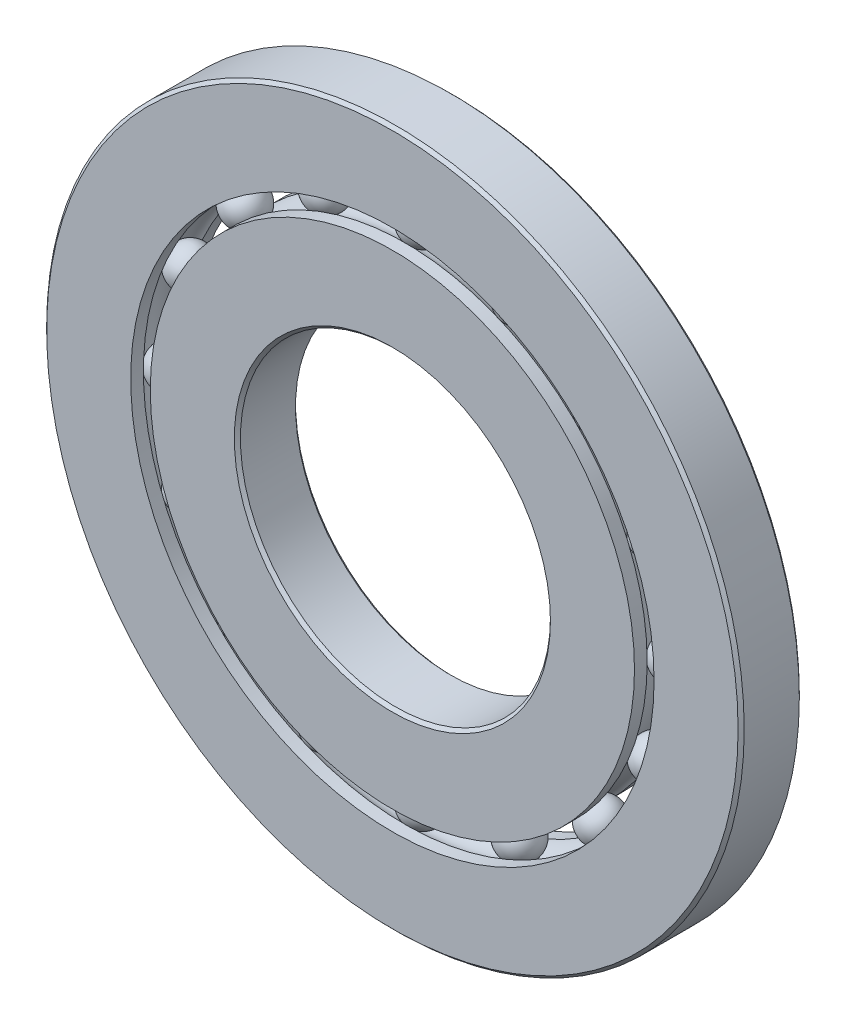
ISO-10303-21;
HEADER;
FILE_DESCRIPTION(('STEP AP214'),'2;1');
FILE_NAME('part.step','',(''),(''),'','','');
FILE_SCHEMA(('AUTOMOTIVE_DESIGN { 1 0 10303 214 1 1 1 1 }'));
ENDSEC;
DATA;
#1=APPLICATION_CONTEXT('core data for automotive mechanical design processes');
#2=APPLICATION_PROTOCOL_DEFINITION('international standard','automotive_design',2000,#1);
#3=PRODUCT_CONTEXT('',#1,'mechanical');
#4=PRODUCT('Part','Part','',(#3));
#5=PRODUCT_RELATED_PRODUCT_CATEGORY('part','',(#4));
#6=PRODUCT_DEFINITION_FORMATION('','',#4);
#7=PRODUCT_DEFINITION_CONTEXT('part definition',#1,'design');
#8=PRODUCT_DEFINITION('design','',#6,#7);
#9=PRODUCT_DEFINITION_SHAPE('','',#8);
#10=(LENGTH_UNIT() NAMED_UNIT(*) SI_UNIT(.MILLI.,.METRE.));
#11=(NAMED_UNIT(*) PLANE_ANGLE_UNIT() SI_UNIT($,.RADIAN.));
#12=(NAMED_UNIT(*) SI_UNIT($,.STERADIAN.) SOLID_ANGLE_UNIT());
#13=UNCERTAINTY_MEASURE_WITH_UNIT(LENGTH_MEASURE(1.E-05),#10,'distance_accuracy_value','');
#14=(GEOMETRIC_REPRESENTATION_CONTEXT(3) GLOBAL_UNCERTAINTY_ASSIGNED_CONTEXT((#13)) GLOBAL_UNIT_ASSIGNED_CONTEXT((#10,
#11,#12)) REPRESENTATION_CONTEXT('',''));
#15=CARTESIAN_POINT('',(0.,0.,0.));
#16=DIRECTION('',(0.,0.,1.));
#17=DIRECTION('',(1.,0.,0.));
#18=AXIS2_PLACEMENT_3D('',#15,#16,#17);
#19=CARTESIAN_POINT('',(-1.2437211551865,3.0026084806617,0.));
#20=DIRECTION('',(0.,0.,1.));
#21=DIRECTION('',(-0.382683432365077,0.923879532511292,0.));
#22=AXIS2_PLACEMENT_3D('',#19,#20,#21);
#23=SPHERICAL_SURFACE('',#22,0.263333333333333);
#24=CARTESIAN_POINT('',(-1.2437211551865,3.0026084806617,0.263333333333334));
#25=VERTEX_POINT('',#24);
#26=VERTEX_LOOP('',#25);
#27=FACE_BOUND('',#26,.T.);
#28=ADVANCED_FACE('F39',(#27),#23,.T.);
#29=CLOSED_SHELL('',(#28));
#30=MANIFOLD_SOLID_BREP('B2',#29);
#31=CARTESIAN_POINT('',(-2.29809703885625,2.29809703885631,0.));
#32=DIRECTION('',(0.,0.,1.));
#33=DIRECTION('',(-0.707106781186539,0.707106781186556,0.));
#34=AXIS2_PLACEMENT_3D('',#31,#32,#33);
#35=SPHERICAL_SURFACE('',#34,0.263333333333333);
#36=CARTESIAN_POINT('',(-2.29809703885625,2.29809703885631,0.263333333333334));
#37=VERTEX_POINT('',#36);
#38=VERTEX_LOOP('',#37);
#39=FACE_BOUND('',#38,.T.);
#40=ADVANCED_FACE('F59',(#39),#35,.T.);
#41=CLOSED_SHELL('',(#40));
#42=MANIFOLD_SOLID_BREP('B6',#41);
#43=CARTESIAN_POINT('',(-3.00260848066167,1.24372115518657,0.));
#44=DIRECTION('',(0.,0.,1.));
#45=DIRECTION('',(-0.923879532511283,0.3826834323651,0.));
#46=AXIS2_PLACEMENT_3D('',#43,#44,#45);
#47=SPHERICAL_SURFACE('',#46,0.263333333333333);
#48=CARTESIAN_POINT('',(-3.00260848066167,1.24372115518657,0.263333333333334));
#49=VERTEX_POINT('',#48);
#50=VERTEX_LOOP('',#49);
#51=FACE_BOUND('',#50,.T.);
#52=ADVANCED_FACE('F79',(#51),#47,.T.);
#53=CLOSED_SHELL('',(#52));
#54=MANIFOLD_SOLID_BREP('B35',#53);
#55=CARTESIAN_POINT('',(-3.25,0.,0.));
#56=DIRECTION('',(0.,0.,1.));
#57=DIRECTION('',(-1.,0.,0.));
#58=AXIS2_PLACEMENT_3D('',#55,#56,#57);
#59=SPHERICAL_SURFACE('',#58,0.263333333333333);
#60=CARTESIAN_POINT('',(-3.25,0.,0.263333333333334));
#61=VERTEX_POINT('',#60);
#62=VERTEX_LOOP('',#61);
#63=FACE_BOUND('',#62,.T.);
#64=ADVANCED_FACE('F99',(#63),#59,.T.);
#65=CLOSED_SHELL('',(#64));
#66=MANIFOLD_SOLID_BREP('B55',#65);
#67=CARTESIAN_POINT('',(-3.00260848066169,-1.24372115518651,0.));
#68=DIRECTION('',(0.,0.,1.));
#69=DIRECTION('',(-0.923879532511291,-0.382683432365081,0.));
#70=AXIS2_PLACEMENT_3D('',#67,#68,#69);
#71=SPHERICAL_SURFACE('',#70,0.263333333333333);
#72=CARTESIAN_POINT('',(-3.00260848066169,-1.24372115518651,0.263333333333334));
#73=VERTEX_POINT('',#72);
#74=VERTEX_LOOP('',#73);
#75=FACE_BOUND('',#74,.T.);
#76=ADVANCED_FACE('F119',(#75),#71,.T.);
#77=CLOSED_SHELL('',(#76));
#78=MANIFOLD_SOLID_BREP('B75',#77);
#79=CARTESIAN_POINT('',(-2.2980970388563,-2.29809703885626,0.));
#80=DIRECTION('',(0.,0.,1.));
#81=DIRECTION('',(-0.707106781186554,-0.707106781186541,0.));
#82=AXIS2_PLACEMENT_3D('',#79,#80,#81);
#83=SPHERICAL_SURFACE('',#82,0.263333333333333);
#84=CARTESIAN_POINT('',(-2.2980970388563,-2.29809703885626,0.263333333333334));
#85=VERTEX_POINT('',#84);
#86=VERTEX_LOOP('',#85);
#87=FACE_BOUND('',#86,.T.);
#88=ADVANCED_FACE('F139',(#87),#83,.T.);
#89=CLOSED_SHELL('',(#88));
#90=MANIFOLD_SOLID_BREP('B95',#89);
#91=CARTESIAN_POINT('',(-1.24372115518657,-3.00260848066167,0.));
#92=DIRECTION('',(0.,0.,1.));
#93=DIRECTION('',(-0.382683432365097,-0.923879532511284,0.));
#94=AXIS2_PLACEMENT_3D('',#91,#92,#93);
#95=SPHERICAL_SURFACE('',#94,0.263333333333333);
#96=CARTESIAN_POINT('',(-1.24372115518657,-3.00260848066167,0.263333333333334));
#97=VERTEX_POINT('',#96);
#98=VERTEX_LOOP('',#97);
#99=FACE_BOUND('',#98,.T.);
#100=ADVANCED_FACE('F159',(#99),#95,.T.);
#101=CLOSED_SHELL('',(#100));
#102=MANIFOLD_SOLID_BREP('B115',#101);
#103=CARTESIAN_POINT('',(0.,-3.25,0.));
#104=DIRECTION('',(0.,0.,1.));
#105=DIRECTION('',(0.,-1.,0.));
#106=AXIS2_PLACEMENT_3D('',#103,#104,#105);
#107=SPHERICAL_SURFACE('',#106,0.263333333333333);
#108=CARTESIAN_POINT('',(0.,-3.25,0.263333333333334));
#109=VERTEX_POINT('',#108);
#110=VERTEX_LOOP('',#109);
#111=FACE_BOUND('',#110,.T.);
#112=ADVANCED_FACE('F179',(#111),#107,.T.);
#113=CLOSED_SHELL('',(#112));
#114=MANIFOLD_SOLID_BREP('B135',#113);
#115=CARTESIAN_POINT('',(1.24372115518652,-3.00260848066169,0.));
#116=DIRECTION('',(0.,0.,1.));
#117=DIRECTION('',(0.382683432365084,-0.923879532511289,0.));
#118=AXIS2_PLACEMENT_3D('',#115,#116,#117);
#119=SPHERICAL_SURFACE('',#118,0.263333333333333);
#120=CARTESIAN_POINT('',(1.24372115518652,-3.00260848066169,0.263333333333334));
#121=VERTEX_POINT('',#120);
#122=VERTEX_LOOP('',#121);
#123=FACE_BOUND('',#122,.T.);
#124=ADVANCED_FACE('F199',(#123),#119,.T.);
#125=CLOSED_SHELL('',(#124));
#126=MANIFOLD_SOLID_BREP('B155',#125);
#127=CARTESIAN_POINT('',(2.29809703885627,-2.29809703885629,0.));
#128=DIRECTION('',(0.,0.,1.));
#129=DIRECTION('',(0.707106781186544,-0.707106781186551,0.));
#130=AXIS2_PLACEMENT_3D('',#127,#128,#129);
#131=SPHERICAL_SURFACE('',#130,0.263333333333333);
#132=CARTESIAN_POINT('',(2.29809703885627,-2.29809703885629,0.263333333333334));
#133=VERTEX_POINT('',#132);
#134=VERTEX_LOOP('',#133);
#135=FACE_BOUND('',#134,.T.);
#136=ADVANCED_FACE('F219',(#135),#131,.T.);
#137=CLOSED_SHELL('',(#136));
#138=MANIFOLD_SOLID_BREP('B175',#137);
#139=CARTESIAN_POINT('',(3.00260848066168,-1.24372115518655,0.));
#140=DIRECTION('',(0.,0.,1.));
#141=DIRECTION('',(0.923879532511285,-0.382683432365094,0.));
#142=AXIS2_PLACEMENT_3D('',#139,#140,#141);
#143=SPHERICAL_SURFACE('',#142,0.263333333333333);
#144=CARTESIAN_POINT('',(3.00260848066168,-1.24372115518655,0.263333333333334));
#145=VERTEX_POINT('',#144);
#146=VERTEX_LOOP('',#145);
#147=FACE_BOUND('',#146,.T.);
#148=ADVANCED_FACE('F239',(#147),#143,.T.);
#149=CLOSED_SHELL('',(#148));
#150=MANIFOLD_SOLID_BREP('B195',#149);
#151=CARTESIAN_POINT('',(3.25,0.,0.));
#152=DIRECTION('',(0.,0.,1.));
#153=DIRECTION('',(1.,0.,0.));
#154=AXIS2_PLACEMENT_3D('',#151,#152,#153);
#155=SPHERICAL_SURFACE('',#154,0.263333333333333);
#156=CARTESIAN_POINT('',(3.25,0.,0.263333333333334));
#157=VERTEX_POINT('',#156);
#158=VERTEX_LOOP('',#157);
#159=FACE_BOUND('',#158,.T.);
#160=ADVANCED_FACE('F259',(#159),#155,.T.);
#161=CLOSED_SHELL('',(#160));
#162=MANIFOLD_SOLID_BREP('B215',#161);
#163=CARTESIAN_POINT('',(3.00260848066168,1.24372115518653,0.));
#164=DIRECTION('',(0.,0.,1.));
#165=DIRECTION('',(0.923879532511288,0.382683432365087,0.));
#166=AXIS2_PLACEMENT_3D('',#163,#164,#165);
#167=SPHERICAL_SURFACE('',#166,0.263333333333333);
#168=CARTESIAN_POINT('',(3.00260848066168,1.24372115518653,0.263333333333334));
#169=VERTEX_POINT('',#168);
#170=VERTEX_LOOP('',#169);
#171=FACE_BOUND('',#170,.T.);
#172=ADVANCED_FACE('F279',(#171),#167,.T.);
#173=CLOSED_SHELL('',(#172));
#174=MANIFOLD_SOLID_BREP('B235',#173);
#175=CARTESIAN_POINT('',(2.29809703885628,2.29809703885628,0.));
#176=DIRECTION('',(0.,0.,1.));
#177=DIRECTION('',(0.707106781186549,0.707106781186546,0.));
#178=AXIS2_PLACEMENT_3D('',#175,#176,#177);
#179=SPHERICAL_SURFACE('',#178,0.263333333333333);
#180=CARTESIAN_POINT('',(2.29809703885628,2.29809703885628,0.263333333333334));
#181=VERTEX_POINT('',#180);
#182=VERTEX_LOOP('',#181);
#183=FACE_BOUND('',#182,.T.);
#184=ADVANCED_FACE('F299',(#183),#179,.T.);
#185=CLOSED_SHELL('',(#184));
#186=MANIFOLD_SOLID_BREP('B255',#185);
#187=CARTESIAN_POINT('',(1.24372115518654,3.00260848066168,0.));
#188=DIRECTION('',(0.,0.,1.));
#189=DIRECTION('',(0.382683432365091,0.923879532511287,0.));
#190=AXIS2_PLACEMENT_3D('',#187,#188,#189);
#191=SPHERICAL_SURFACE('',#190,0.263333333333333);
#192=CARTESIAN_POINT('',(1.24372115518654,3.00260848066168,0.263333333333334));
#193=VERTEX_POINT('',#192);
#194=VERTEX_LOOP('',#193);
#195=FACE_BOUND('',#194,.T.);
#196=ADVANCED_FACE('F319',(#195),#191,.T.);
#197=CLOSED_SHELL('',(#196));
#198=MANIFOLD_SOLID_BREP('B275',#197);
#199=CARTESIAN_POINT('',(0.,3.25,0.));
#200=DIRECTION('',(0.,0.,1.));
#201=DIRECTION('',(0.,1.,0.));
#202=AXIS2_PLACEMENT_3D('',#199,#200,#201);
#203=SPHERICAL_SURFACE('',#202,0.263333333333333);
#204=CARTESIAN_POINT('',(0.,3.25,0.263333333333334));
#205=VERTEX_POINT('',#204);
#206=VERTEX_LOOP('',#205);
#207=FACE_BOUND('',#206,.T.);
#208=ADVANCED_FACE('F341',(#207),#203,.T.);
#209=CLOSED_SHELL('',(#208));
#210=MANIFOLD_SOLID_BREP('B295',#209);
#211=CARTESIAN_POINT('',(0.,3.12369230769231,0.395));
#212=DIRECTION('',(0.,0.,-1.));
#213=DIRECTION('',(-1.,0.,0.));
#214=AXIS2_PLACEMENT_3D('',#211,#212,#213);
#215=PLANE('',#214);
#216=CARTESIAN_POINT('',(0.,0.,0.395));
#217=DIRECTION('',(0.,0.,1.));
#218=DIRECTION('',(1.,0.,0.));
#219=AXIS2_PLACEMENT_3D('',#216,#217,#218);
#220=CIRCLE('',#219,2.0395);
#221=CARTESIAN_POINT('',(2.0395,0.,0.395));
#222=VERTEX_POINT('',#221);
#223=EDGE_CURVE('E388',#222,#222,#220,.T.);
#224=ORIENTED_EDGE('',*,*,#223,.F.);
#225=EDGE_LOOP('',(#224));
#226=FACE_BOUND('',#225,.T.);
#227=CARTESIAN_POINT('',(0.,0.,0.395));
#228=DIRECTION('',(0.,0.,1.));
#229=DIRECTION('',(1.,0.,0.));
#230=AXIS2_PLACEMENT_3D('',#227,#228,#229);
#231=CIRCLE('',#230,3.12369230769231);
#232=CARTESIAN_POINT('',(3.12369230769231,0.,0.395));
#233=VERTEX_POINT('',#232);
#234=EDGE_CURVE('E340',#233,#233,#231,.T.);
#235=ORIENTED_EDGE('',*,*,#234,.T.);
#236=EDGE_LOOP('',(#235));
#237=FACE_BOUND('',#236,.T.);
#238=ADVANCED_FACE('F360',(#226,#237),#215,.F.);
#239=CARTESIAN_POINT('',(0.,0.,0.395));
#240=DIRECTION('',(0.,0.,1.));
#241=DIRECTION('',(1.,0.,0.));
#242=AXIS2_PLACEMENT_3D('',#239,#240,#241);
#243=CYLINDRICAL_SURFACE('',#242,3.12369230769231);
#244=ORIENTED_EDGE('',*,*,#234,.F.);
#245=EDGE_LOOP('',(#244));
#246=FACE_BOUND('',#245,.T.);
#247=CARTESIAN_POINT('',(0.,0.,0.231064517631657));
#248=DIRECTION('',(0.,0.,1.));
#249=DIRECTION('',(1.,0.,0.));
#250=AXIS2_PLACEMENT_3D('',#247,#248,#249);
#251=CIRCLE('',#250,3.12369230769231);
#252=CARTESIAN_POINT('',(3.12369230769231,0.,0.231064517631657));
#253=VERTEX_POINT('',#252);
#254=EDGE_CURVE('E366',#253,#253,#251,.T.);
#255=ORIENTED_EDGE('',*,*,#254,.T.);
#256=EDGE_LOOP('',(#255));
#257=FACE_BOUND('',#256,.T.);
#258=ADVANCED_FACE('F395',(#246,#257),#243,.T.);
#259=CARTESIAN_POINT('',(0.,0.,0.));
#260=DIRECTION('',(0.,0.,1.));
#261=DIRECTION('',(1.,0.,0.));
#262=AXIS2_PLACEMENT_3D('',#259,#260,#261);
#263=TOROIDAL_SURFACE('',#262,3.25,0.263333333333334);
#264=ORIENTED_EDGE('',*,*,#254,.F.);
#265=EDGE_LOOP('',(#264));
#266=FACE_BOUND('',#265,.T.);
#267=CARTESIAN_POINT('',(0.,0.,-0.231064517631657));
#268=DIRECTION('',(0.,0.,1.));
#269=DIRECTION('',(1.,0.,0.));
#270=AXIS2_PLACEMENT_3D('',#267,#268,#269);
#271=CIRCLE('',#270,3.12369230769231);
#272=CARTESIAN_POINT('',(3.12369230769231,0.,-0.231064517631657));
#273=VERTEX_POINT('',#272);
#274=EDGE_CURVE('E370',#273,#273,#271,.T.);
#275=ORIENTED_EDGE('',*,*,#274,.T.);
#276=EDGE_LOOP('',(#275));
#277=FACE_BOUND('',#276,.T.);
#278=ADVANCED_FACE('F399',(#266,#277),#263,.F.);
#279=CARTESIAN_POINT('',(0.,0.,0.395));
#280=DIRECTION('',(0.,0.,1.));
#281=DIRECTION('',(1.,0.,0.));
#282=AXIS2_PLACEMENT_3D('',#279,#280,#281);
#283=CYLINDRICAL_SURFACE('',#282,3.12369230769231);
#284=ORIENTED_EDGE('',*,*,#274,.F.);
#285=EDGE_LOOP('',(#284));
#286=FACE_BOUND('',#285,.T.);
#287=CARTESIAN_POINT('',(0.,0.,-0.395));
#288=DIRECTION('',(0.,0.,1.));
#289=DIRECTION('',(1.,0.,0.));
#290=AXIS2_PLACEMENT_3D('',#287,#288,#289);
#291=CIRCLE('',#290,3.12369230769231);
#292=CARTESIAN_POINT('',(3.12369230769231,0.,-0.395));
#293=VERTEX_POINT('',#292);
#294=EDGE_CURVE('E374',#293,#293,#291,.T.);
#295=ORIENTED_EDGE('',*,*,#294,.T.);
#296=EDGE_LOOP('',(#295));
#297=FACE_BOUND('',#296,.T.);
#298=ADVANCED_FACE('F404',(#286,#297),#283,.T.);
#299=CARTESIAN_POINT('',(0.,2.0395,-0.395));
#300=DIRECTION('',(0.,0.,1.));
#301=DIRECTION('',(1.,0.,0.));
#302=AXIS2_PLACEMENT_3D('',#299,#300,#301);
#303=PLANE('',#302);
#304=ORIENTED_EDGE('',*,*,#294,.F.);
#305=EDGE_LOOP('',(#304));
#306=FACE_BOUND('',#305,.T.);
#307=CARTESIAN_POINT('',(0.,0.,-0.395));
#308=DIRECTION('',(0.,0.,1.));
#309=DIRECTION('',(1.,0.,0.));
#310=AXIS2_PLACEMENT_3D('',#307,#308,#309);
#311=CIRCLE('',#310,2.0395);
#312=CARTESIAN_POINT('',(2.0395,0.,-0.395));
#313=VERTEX_POINT('',#312);
#314=EDGE_CURVE('E379',#313,#313,#311,.T.);
#315=ORIENTED_EDGE('',*,*,#314,.T.);
#316=EDGE_LOOP('',(#315));
#317=FACE_BOUND('',#316,.T.);
#318=ADVANCED_FACE('F410',(#306,#317),#303,.F.);
#319=CARTESIAN_POINT('',(0.,0.,-0.355499999999999));
#320=DIRECTION('',(0.,0.,-1.));
#321=DIRECTION('',(-1.,0.,0.));
#322=AXIS2_PLACEMENT_3D('',#319,#320,#321);
#323=CONICAL_SURFACE('',#322,2.,0.785398163397421);
#324=ORIENTED_EDGE('',*,*,#314,.F.);
#325=EDGE_LOOP('',(#324));
#326=FACE_BOUND('',#325,.T.);
#327=CARTESIAN_POINT('',(0.,0.,-0.355499999999999));
#328=DIRECTION('',(0.,0.,1.));
#329=DIRECTION('',(1.,0.,0.));
#330=AXIS2_PLACEMENT_3D('',#327,#328,#329);
#331=CIRCLE('',#330,2.);
#332=CARTESIAN_POINT('',(2.,0.,-0.355499999999999));
#333=VERTEX_POINT('',#332);
#334=EDGE_CURVE('E382',#333,#333,#331,.T.);
#335=ORIENTED_EDGE('',*,*,#334,.T.);
#336=EDGE_LOOP('',(#335));
#337=FACE_BOUND('',#336,.T.);
#338=ADVANCED_FACE('F414',(#326,#337),#323,.F.);
#339=CARTESIAN_POINT('',(0.,0.,0.395));
#340=DIRECTION('',(0.,0.,1.));
#341=DIRECTION('',(1.,0.,0.));
#342=AXIS2_PLACEMENT_3D('',#339,#340,#341);
#343=CYLINDRICAL_SURFACE('',#342,2.);
#344=ORIENTED_EDGE('',*,*,#334,.F.);
#345=EDGE_LOOP('',(#344));
#346=FACE_BOUND('',#345,.T.);
#347=CARTESIAN_POINT('',(0.,0.,0.355500000000002));
#348=DIRECTION('',(0.,0.,1.));
#349=DIRECTION('',(1.,0.,0.));
#350=AXIS2_PLACEMENT_3D('',#347,#348,#349);
#351=CIRCLE('',#350,2.);
#352=CARTESIAN_POINT('',(2.,0.,0.355500000000002));
#353=VERTEX_POINT('',#352);
#354=EDGE_CURVE('E385',#353,#353,#351,.T.);
#355=ORIENTED_EDGE('',*,*,#354,.T.);
#356=EDGE_LOOP('',(#355));
#357=FACE_BOUND('',#356,.T.);
#358=ADVANCED_FACE('F418',(#346,#357),#343,.F.);
#359=CARTESIAN_POINT('',(0.,0.,0.395));
#360=DIRECTION('',(0.,0.,1.));
#361=DIRECTION('',(1.,0.,0.));
#362=AXIS2_PLACEMENT_3D('',#359,#360,#361);
#363=CONICAL_SURFACE('',#362,2.0395,0.785398163397483);
#364=ORIENTED_EDGE('',*,*,#354,.F.);
#365=EDGE_LOOP('',(#364));
#366=FACE_BOUND('',#365,.T.);
#367=ORIENTED_EDGE('',*,*,#223,.T.);
#368=EDGE_LOOP('',(#367));
#369=FACE_BOUND('',#368,.T.);
#370=ADVANCED_FACE('F392',(#366,#369),#363,.F.);
#371=CLOSED_SHELL('',(#238,#258,#278,#298,#318,#338,#358,#370));
#372=MANIFOLD_SOLID_BREP('B315',#371);
#373=CARTESIAN_POINT('',(0.,0.,0.355500000000001));
#374=DIRECTION('',(0.,0.,-1.));
#375=DIRECTION('',(-1.,0.,0.));
#376=AXIS2_PLACEMENT_3D('',#373,#374,#375);
#377=CONICAL_SURFACE('',#376,4.5,0.785398163397444);
#378=CARTESIAN_POINT('',(0.,0.,0.395000000000001));
#379=DIRECTION('',(0.,0.,1.));
#380=DIRECTION('',(1.,0.,0.));
#381=AXIS2_PLACEMENT_3D('',#378,#379,#380);
#382=CIRCLE('',#381,4.4605);
#383=CARTESIAN_POINT('',(4.4605,0.,0.395000000000001));
#384=VERTEX_POINT('',#383);
#385=EDGE_CURVE('E509',#384,#384,#382,.T.);
#386=ORIENTED_EDGE('',*,*,#385,.F.);
#387=EDGE_LOOP('',(#386));
#388=FACE_BOUND('',#387,.T.);
#389=CARTESIAN_POINT('',(0.,0.,0.355500000000001));
#390=DIRECTION('',(0.,0.,1.));
#391=DIRECTION('',(1.,0.,0.));
#392=AXIS2_PLACEMENT_3D('',#389,#390,#391);
#393=CIRCLE('',#392,4.5);
#394=CARTESIAN_POINT('',(4.5,0.,0.355500000000001));
#395=VERTEX_POINT('',#394);
#396=EDGE_CURVE('E359',#395,#395,#393,.T.);
#397=ORIENTED_EDGE('',*,*,#396,.T.);
#398=EDGE_LOOP('',(#397));
#399=FACE_BOUND('',#398,.T.);
#400=ADVANCED_FACE('F481',(#388,#399),#377,.T.);
#401=CARTESIAN_POINT('',(0.,0.,0.395));
#402=DIRECTION('',(0.,0.,1.));
#403=DIRECTION('',(1.,0.,0.));
#404=AXIS2_PLACEMENT_3D('',#401,#402,#403);
#405=CYLINDRICAL_SURFACE('',#404,4.5);
#406=ORIENTED_EDGE('',*,*,#396,.F.);
#407=EDGE_LOOP('',(#406));
#408=FACE_BOUND('',#407,.T.);
#409=CARTESIAN_POINT('',(0.,0.,-0.3555));
#410=DIRECTION('',(0.,0.,1.));
#411=DIRECTION('',(1.,0.,0.));
#412=AXIS2_PLACEMENT_3D('',#409,#410,#411);
#413=CIRCLE('',#412,4.5);
#414=CARTESIAN_POINT('',(4.5,0.,-0.3555));
#415=VERTEX_POINT('',#414);
#416=EDGE_CURVE('E487',#415,#415,#413,.T.);
#417=ORIENTED_EDGE('',*,*,#416,.T.);
#418=EDGE_LOOP('',(#417));
#419=FACE_BOUND('',#418,.T.);
#420=ADVANCED_FACE('F516',(#408,#419),#405,.T.);
#421=CARTESIAN_POINT('',(0.,0.,-0.395));
#422=DIRECTION('',(0.,0.,1.));
#423=DIRECTION('',(1.,0.,0.));
#424=AXIS2_PLACEMENT_3D('',#421,#422,#423);
#425=CONICAL_SURFACE('',#424,4.4605,0.785398163397443);
#426=ORIENTED_EDGE('',*,*,#416,.F.);
#427=EDGE_LOOP('',(#426));
#428=FACE_BOUND('',#427,.T.);
#429=CARTESIAN_POINT('',(0.,0.,-0.395));
#430=DIRECTION('',(0.,0.,1.));
#431=DIRECTION('',(1.,0.,0.));
#432=AXIS2_PLACEMENT_3D('',#429,#430,#431);
#433=CIRCLE('',#432,4.4605);
#434=CARTESIAN_POINT('',(4.4605,0.,-0.395));
#435=VERTEX_POINT('',#434);
#436=EDGE_CURVE('E491',#435,#435,#433,.T.);
#437=ORIENTED_EDGE('',*,*,#436,.T.);
#438=EDGE_LOOP('',(#437));
#439=FACE_BOUND('',#438,.T.);
#440=ADVANCED_FACE('F520',(#428,#439),#425,.T.);
#441=CARTESIAN_POINT('',(0.,4.4605,-0.395));
#442=DIRECTION('',(0.,0.,1.));
#443=DIRECTION('',(1.,0.,0.));
#444=AXIS2_PLACEMENT_3D('',#441,#442,#443);
#445=PLANE('',#444);
#446=ORIENTED_EDGE('',*,*,#436,.F.);
#447=EDGE_LOOP('',(#446));
#448=FACE_BOUND('',#447,.T.);
#449=CARTESIAN_POINT('',(0.,0.,-0.395000000000001));
#450=DIRECTION('',(0.,0.,1.));
#451=DIRECTION('',(1.,0.,0.));
#452=AXIS2_PLACEMENT_3D('',#449,#450,#451);
#453=CIRCLE('',#452,3.37630769230769);
#454=CARTESIAN_POINT('',(3.37630769230769,0.,-0.395000000000001));
#455=VERTEX_POINT('',#454);
#456=EDGE_CURVE('E495',#455,#455,#453,.T.);
#457=ORIENTED_EDGE('',*,*,#456,.T.);
#458=EDGE_LOOP('',(#457));
#459=FACE_BOUND('',#458,.T.);
#460=ADVANCED_FACE('F525',(#448,#459),#445,.F.);
#461=CARTESIAN_POINT('',(0.,0.,0.395));
#462=DIRECTION('',(0.,0.,1.));
#463=DIRECTION('',(1.,0.,0.));
#464=AXIS2_PLACEMENT_3D('',#461,#462,#463);
#465=CYLINDRICAL_SURFACE('',#464,3.37630769230769);
#466=ORIENTED_EDGE('',*,*,#456,.F.);
#467=EDGE_LOOP('',(#466));
#468=FACE_BOUND('',#467,.T.);
#469=CARTESIAN_POINT('',(0.,0.,-0.231064517631656));
#470=DIRECTION('',(0.,0.,1.));
#471=DIRECTION('',(1.,0.,0.));
#472=AXIS2_PLACEMENT_3D('',#469,#470,#471);
#473=CIRCLE('',#472,3.37630769230769);
#474=CARTESIAN_POINT('',(3.37630769230769,0.,-0.231064517631656));
#475=VERTEX_POINT('',#474);
#476=EDGE_CURVE('E500',#475,#475,#473,.T.);
#477=ORIENTED_EDGE('',*,*,#476,.T.);
#478=EDGE_LOOP('',(#477));
#479=FACE_BOUND('',#478,.T.);
#480=ADVANCED_FACE('F531',(#468,#479),#465,.F.);
#481=CARTESIAN_POINT('',(0.,0.,0.));
#482=DIRECTION('',(0.,0.,1.));
#483=DIRECTION('',(1.,0.,0.));
#484=AXIS2_PLACEMENT_3D('',#481,#482,#483);
#485=TOROIDAL_SURFACE('',#484,3.25,0.263333333333334);
#486=ORIENTED_EDGE('',*,*,#476,.F.);
#487=EDGE_LOOP('',(#486));
#488=FACE_BOUND('',#487,.T.);
#489=CARTESIAN_POINT('',(0.,0.,0.231064517631657));
#490=DIRECTION('',(0.,0.,1.));
#491=DIRECTION('',(1.,0.,0.));
#492=AXIS2_PLACEMENT_3D('',#489,#490,#491);
#493=CIRCLE('',#492,3.37630769230769);
#494=CARTESIAN_POINT('',(3.37630769230769,0.,0.231064517631657));
#495=VERTEX_POINT('',#494);
#496=EDGE_CURVE('E503',#495,#495,#493,.T.);
#497=ORIENTED_EDGE('',*,*,#496,.T.);
#498=EDGE_LOOP('',(#497));
#499=FACE_BOUND('',#498,.T.);
#500=ADVANCED_FACE('F535',(#488,#499),#485,.F.);
#501=CARTESIAN_POINT('',(0.,0.,0.395));
#502=DIRECTION('',(0.,0.,1.));
#503=DIRECTION('',(1.,0.,0.));
#504=AXIS2_PLACEMENT_3D('',#501,#502,#503);
#505=CYLINDRICAL_SURFACE('',#504,3.37630769230769);
#506=ORIENTED_EDGE('',*,*,#496,.F.);
#507=EDGE_LOOP('',(#506));
#508=FACE_BOUND('',#507,.T.);
#509=CARTESIAN_POINT('',(0.,0.,0.395));
#510=DIRECTION('',(0.,0.,1.));
#511=DIRECTION('',(1.,0.,0.));
#512=AXIS2_PLACEMENT_3D('',#509,#510,#511);
#513=CIRCLE('',#512,3.37630769230769);
#514=CARTESIAN_POINT('',(3.37630769230769,0.,0.395));
#515=VERTEX_POINT('',#514);
#516=EDGE_CURVE('E506',#515,#515,#513,.T.);
#517=ORIENTED_EDGE('',*,*,#516,.T.);
#518=EDGE_LOOP('',(#517));
#519=FACE_BOUND('',#518,.T.);
#520=ADVANCED_FACE('F539',(#508,#519),#505,.F.);
#521=CARTESIAN_POINT('',(0.,4.4605,0.395000000000001));
#522=DIRECTION('',(0.,0.,-1.));
#523=DIRECTION('',(-1.,0.,0.));
#524=AXIS2_PLACEMENT_3D('',#521,#522,#523);
#525=PLANE('',#524);
#526=ORIENTED_EDGE('',*,*,#516,.F.);
#527=EDGE_LOOP('',(#526));
#528=FACE_BOUND('',#527,.T.);
#529=ORIENTED_EDGE('',*,*,#385,.T.);
#530=EDGE_LOOP('',(#529));
#531=FACE_BOUND('',#530,.T.);
#532=ADVANCED_FACE('F513',(#528,#531),#525,.F.);
#533=CLOSED_SHELL('',(#400,#420,#440,#460,#480,#500,#520,#532));
#534=MANIFOLD_SOLID_BREP('B335',#533);
#535=ADVANCED_BREP_SHAPE_REPRESENTATION('',(#18,#30,#42,#54,#66,#78,#90,#102,#114,#126,#138,
#150,#162,#174,#186,#198,#210,#372,#534),#14);
#536=SHAPE_DEFINITION_REPRESENTATION(#9,#535);
ENDSEC;
END-ISO-10303-21;
